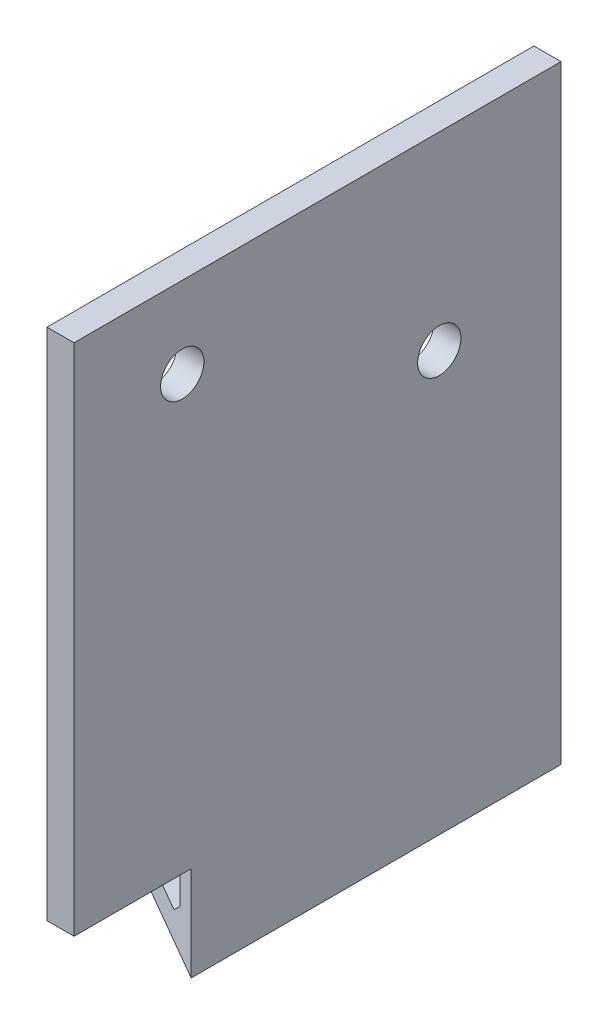
ISO-10303-21;
HEADER;
FILE_DESCRIPTION(('STEP AP214'),'2;1');
FILE_NAME('part.step','',(''),(''),'','','');
FILE_SCHEMA(('AUTOMOTIVE_DESIGN { 1 0 10303 214 1 1 1 1 }'));
ENDSEC;
DATA;
#1=APPLICATION_CONTEXT('core data for automotive mechanical design processes');
#2=APPLICATION_PROTOCOL_DEFINITION('international standard','automotive_design',2000,#1);
#3=PRODUCT_CONTEXT('',#1,'mechanical');
#4=PRODUCT('Part','Part','',(#3));
#5=PRODUCT_RELATED_PRODUCT_CATEGORY('part','',(#4));
#6=PRODUCT_DEFINITION_FORMATION('','',#4);
#7=PRODUCT_DEFINITION_CONTEXT('part definition',#1,'design');
#8=PRODUCT_DEFINITION('design','',#6,#7);
#9=PRODUCT_DEFINITION_SHAPE('','',#8);
#10=(LENGTH_UNIT() NAMED_UNIT(*) SI_UNIT(.MILLI.,.METRE.));
#11=(NAMED_UNIT(*) PLANE_ANGLE_UNIT() SI_UNIT($,.RADIAN.));
#12=(NAMED_UNIT(*) SI_UNIT($,.STERADIAN.) SOLID_ANGLE_UNIT());
#13=UNCERTAINTY_MEASURE_WITH_UNIT(LENGTH_MEASURE(1.E-05),#10,'distance_accuracy_value','');
#14=(GEOMETRIC_REPRESENTATION_CONTEXT(3) GLOBAL_UNCERTAINTY_ASSIGNED_CONTEXT((#13)) GLOBAL_UNIT_ASSIGNED_CONTEXT((#10,
#11,#12)) REPRESENTATION_CONTEXT('',''));
#15=CARTESIAN_POINT('',(0.,0.,0.));
#16=DIRECTION('',(0.,0.,1.));
#17=DIRECTION('',(1.,0.,0.));
#18=AXIS2_PLACEMENT_3D('',#15,#16,#17);
#19=CARTESIAN_POINT('',(0.,2.,36.));
#20=DIRECTION('',(1.,0.,0.));
#21=DIRECTION('',(0.,0.,-1.));
#22=AXIS2_PLACEMENT_3D('',#19,#20,#21);
#23=PLANE('',#22);
#24=DIRECTION('',(0.,0.,-1.));
#25=VECTOR('',#24,1.);
#26=CARTESIAN_POINT('',(0.,0.,36.));
#27=LINE('',#26,#25);
#28=CARTESIAN_POINT('',(0.,0.,18.6794919243115));
#29=VERTEX_POINT('',#28);
#30=CARTESIAN_POINT('',(0.,0.,0.));
#31=VERTEX_POINT('',#30);
#32=EDGE_CURVE('E242',#29,#31,#27,.T.);
#33=ORIENTED_EDGE('',*,*,#32,.F.);
#34=DIRECTION('',(0.,1.,0.));
#35=VECTOR('',#34,1.);
#36=CARTESIAN_POINT('',(0.,-0.00100000000000187,18.6794919243115));
#37=LINE('',#36,#35);
#38=CARTESIAN_POINT('',(0.,2.,18.6794919243115));
#39=VERTEX_POINT('',#38);
#40=EDGE_CURVE('E163',#29,#39,#37,.T.);
#41=ORIENTED_EDGE('',*,*,#40,.T.);
#42=DIRECTION('',(0.,0.,-1.));
#43=VECTOR('',#42,1.);
#44=CARTESIAN_POINT('',(0.,2.,36.));
#45=LINE('',#44,#43);
#46=CARTESIAN_POINT('',(0.,2.,0.));
#47=VERTEX_POINT('',#46);
#48=EDGE_CURVE('E210',#39,#47,#45,.T.);
#49=ORIENTED_EDGE('',*,*,#48,.T.);
#50=DIRECTION('',(0.,-1.,0.));
#51=VECTOR('',#50,1.);
#52=CARTESIAN_POINT('',(0.,2.,0.));
#53=LINE('',#52,#51);
#54=EDGE_CURVE('E193',#47,#31,#53,.T.);
#55=ORIENTED_EDGE('',*,*,#54,.T.);
#56=EDGE_LOOP('',(#33,#41,#49,#55));
#57=FACE_BOUND('',#56,.T.);
#58=ADVANCED_FACE('F45',(#57),#23,.F.);
#59=CARTESIAN_POINT('',(0.,0.,36.));
#60=DIRECTION('',(0.,1.,0.));
#61=DIRECTION('',(0.,0.,1.));
#62=AXIS2_PLACEMENT_3D('',#59,#60,#61);
#63=PLANE('',#62);
#64=CARTESIAN_POINT('',(7.5,0.,18.));
#65=DIRECTION('',(0.,-1.,0.));
#66=DIRECTION('',(0.,0.,-1.));
#67=AXIS2_PLACEMENT_3D('',#64,#65,#66);
#68=CIRCLE('',#67,1.5);
#69=CARTESIAN_POINT('',(7.5,0.,16.5));
#70=VERTEX_POINT('',#69);
#71=EDGE_CURVE('E184',#70,#70,#68,.T.);
#72=ORIENTED_EDGE('',*,*,#71,.F.);
#73=EDGE_LOOP('',(#72));
#74=FACE_BOUND('',#73,.T.);
#75=CARTESIAN_POINT('',(7.5,0.,8.));
#76=DIRECTION('',(0.,-1.,0.));
#77=DIRECTION('',(0.,0.,-1.));
#78=AXIS2_PLACEMENT_3D('',#75,#76,#77);
#79=CIRCLE('',#78,1.5);
#80=CARTESIAN_POINT('',(7.5,0.,6.5));
#81=VERTEX_POINT('',#80);
#82=EDGE_CURVE('E189',#81,#81,#79,.T.);
#83=ORIENTED_EDGE('',*,*,#82,.F.);
#84=EDGE_LOOP('',(#83));
#85=FACE_BOUND('',#84,.T.);
#86=DIRECTION('',(0.,0.,-1.));
#87=VECTOR('',#86,1.);
#88=CARTESIAN_POINT('',(15.,0.,36.));
#89=LINE('',#88,#87);
#90=CARTESIAN_POINT('',(15.,0.,27.3397459621557));
#91=VERTEX_POINT('',#90);
#92=CARTESIAN_POINT('',(15.,0.,0.));
#93=VERTEX_POINT('',#92);
#94=EDGE_CURVE('E239',#91,#93,#89,.T.);
#95=ORIENTED_EDGE('',*,*,#94,.F.);
#96=DIRECTION('',(0.866025403784442,0.,0.499999999999995));
#97=VECTOR('',#96,1.);
#98=CARTESIAN_POINT('',(30.,0.,36.));
#99=LINE('',#98,#97);
#100=EDGE_CURVE('E125',#29,#91,#99,.T.);
#101=ORIENTED_EDGE('',*,*,#100,.F.);
#102=ORIENTED_EDGE('',*,*,#32,.T.);
#103=DIRECTION('',(1.,0.,0.));
#104=VECTOR('',#103,1.);
#105=CARTESIAN_POINT('',(0.,0.,0.));
#106=LINE('',#105,#104);
#107=EDGE_CURVE('E214',#31,#93,#106,.T.);
#108=ORIENTED_EDGE('',*,*,#107,.T.);
#109=EDGE_LOOP('',(#95,#101,#102,#108));
#110=FACE_BOUND('',#109,.T.);
#111=ADVANCED_FACE('F258',(#74,#85,#110),#63,.F.);
#112=CARTESIAN_POINT('',(15.,0.,36.));
#113=DIRECTION('',(-1.,0.,0.));
#114=DIRECTION('',(0.,0.,1.));
#115=AXIS2_PLACEMENT_3D('',#112,#113,#114);
#116=PLANE('',#115);
#117=CARTESIAN_POINT('',(15.,39.,28.));
#118=DIRECTION('',(1.,0.,0.));
#119=DIRECTION('',(0.,0.,-1.));
#120=AXIS2_PLACEMENT_3D('',#117,#118,#119);
#121=CIRCLE('',#120,1.6);
#122=CARTESIAN_POINT('',(15.,39.,26.4));
#123=VERTEX_POINT('',#122);
#124=EDGE_CURVE('E168',#123,#123,#121,.T.);
#125=ORIENTED_EDGE('',*,*,#124,.F.);
#126=EDGE_LOOP('',(#125));
#127=FACE_BOUND('',#126,.T.);
#128=CARTESIAN_POINT('',(15.,31.,9.));
#129=DIRECTION('',(1.,0.,0.));
#130=DIRECTION('',(0.,0.,-1.));
#131=AXIS2_PLACEMENT_3D('',#128,#129,#130);
#132=CIRCLE('',#131,1.6);
#133=CARTESIAN_POINT('',(15.,31.,7.4));
#134=VERTEX_POINT('',#133);
#135=EDGE_CURVE('E173',#134,#134,#132,.T.);
#136=ORIENTED_EDGE('',*,*,#135,.F.);
#137=EDGE_LOOP('',(#136));
#138=FACE_BOUND('',#137,.T.);
#139=DIRECTION('',(0.,0.,1.));
#140=VECTOR('',#139,1.);
#141=CARTESIAN_POINT('',(15.,7.,27.3397459621557));
#142=LINE('',#141,#140);
#143=CARTESIAN_POINT('',(15.,7.,27.3397459621557));
#144=VERTEX_POINT('',#143);
#145=CARTESIAN_POINT('',(15.,7.,36.));
#146=VERTEX_POINT('',#145);
#147=EDGE_CURVE('E134',#144,#146,#142,.T.);
#148=ORIENTED_EDGE('',*,*,#147,.F.);
#149=DIRECTION('',(0.,1.,0.));
#150=VECTOR('',#149,1.);
#151=CARTESIAN_POINT('',(15.,-0.000999999999998331,27.3397459621557));
#152=LINE('',#151,#150);
#153=EDGE_CURVE('E119',#91,#144,#152,.T.);
#154=ORIENTED_EDGE('',*,*,#153,.F.);
#155=ORIENTED_EDGE('',*,*,#94,.T.);
#156=DIRECTION('',(0.,1.,0.));
#157=VECTOR('',#156,1.);
#158=CARTESIAN_POINT('',(15.,0.,0.));
#159=LINE('',#158,#157);
#160=CARTESIAN_POINT('',(15.,45.,0.));
#161=VERTEX_POINT('',#160);
#162=EDGE_CURVE('E218',#93,#161,#159,.T.);
#163=ORIENTED_EDGE('',*,*,#162,.T.);
#164=DIRECTION('',(0.,0.,-1.));
#165=VECTOR('',#164,1.);
#166=CARTESIAN_POINT('',(15.,45.,36.));
#167=LINE('',#166,#165);
#168=CARTESIAN_POINT('',(15.,45.,36.));
#169=VERTEX_POINT('',#168);
#170=EDGE_CURVE('E235',#169,#161,#167,.T.);
#171=ORIENTED_EDGE('',*,*,#170,.F.);
#172=DIRECTION('',(0.,1.,0.));
#173=VECTOR('',#172,1.);
#174=CARTESIAN_POINT('',(15.,0.,36.));
#175=LINE('',#174,#173);
#176=EDGE_CURVE('E142',#146,#169,#175,.T.);
#177=ORIENTED_EDGE('',*,*,#176,.F.);
#178=EDGE_LOOP('',(#148,#154,#155,#163,#171,#177));
#179=FACE_BOUND('',#178,.T.);
#180=ADVANCED_FACE('F140',(#127,#138,#179),#116,.F.);
#181=CARTESIAN_POINT('',(15.,45.,36.));
#182=DIRECTION('',(0.,-1.,0.));
#183=DIRECTION('',(0.,0.,-1.));
#184=AXIS2_PLACEMENT_3D('',#181,#182,#183);
#185=PLANE('',#184);
#186=DIRECTION('',(-1.,0.,0.));
#187=VECTOR('',#186,1.);
#188=CARTESIAN_POINT('',(15.,45.,0.));
#189=LINE('',#188,#187);
#190=CARTESIAN_POINT('',(13.,45.,0.));
#191=VERTEX_POINT('',#190);
#192=EDGE_CURVE('E221',#161,#191,#189,.T.);
#193=ORIENTED_EDGE('',*,*,#192,.T.);
#194=DIRECTION('',(0.,0.,-1.));
#195=VECTOR('',#194,1.);
#196=CARTESIAN_POINT('',(13.,45.,36.));
#197=LINE('',#196,#195);
#198=CARTESIAN_POINT('',(13.,45.,36.));
#199=VERTEX_POINT('',#198);
#200=EDGE_CURVE('E231',#199,#191,#197,.T.);
#201=ORIENTED_EDGE('',*,*,#200,.F.);
#202=DIRECTION('',(-1.,0.,0.));
#203=VECTOR('',#202,1.);
#204=CARTESIAN_POINT('',(15.,45.,36.));
#205=LINE('',#204,#203);
#206=EDGE_CURVE('E202',#169,#199,#205,.T.);
#207=ORIENTED_EDGE('',*,*,#206,.F.);
#208=ORIENTED_EDGE('',*,*,#170,.T.);
#209=EDGE_LOOP('',(#193,#201,#207,#208));
#210=FACE_BOUND('',#209,.T.);
#211=ADVANCED_FACE('F264',(#210),#185,.F.);
#212=CARTESIAN_POINT('',(13.,45.,36.));
#213=DIRECTION('',(1.,0.,0.));
#214=DIRECTION('',(0.,1.,0.));
#215=AXIS2_PLACEMENT_3D('',#212,#213,#214);
#216=PLANE('',#215);
#217=CARTESIAN_POINT('',(13.,39.,28.));
#218=DIRECTION('',(1.,0.,0.));
#219=DIRECTION('',(0.,1.,0.));
#220=AXIS2_PLACEMENT_3D('',#217,#218,#219);
#221=CIRCLE('',#220,1.6);
#222=CARTESIAN_POINT('',(13.,39.,26.4));
#223=VERTEX_POINT('',#222);
#224=EDGE_CURVE('E172',#223,#223,#221,.F.);
#225=ORIENTED_EDGE('',*,*,#224,.F.);
#226=EDGE_LOOP('',(#225));
#227=FACE_BOUND('',#226,.T.);
#228=CARTESIAN_POINT('',(13.,31.,9.));
#229=DIRECTION('',(1.,0.,0.));
#230=DIRECTION('',(0.,1.,0.));
#231=AXIS2_PLACEMENT_3D('',#228,#229,#230);
#232=CIRCLE('',#231,1.6);
#233=CARTESIAN_POINT('',(13.,31.,7.4));
#234=VERTEX_POINT('',#233);
#235=EDGE_CURVE('E167',#234,#234,#232,.F.);
#236=ORIENTED_EDGE('',*,*,#235,.F.);
#237=EDGE_LOOP('',(#236));
#238=FACE_BOUND('',#237,.T.);
#239=DIRECTION('',(0.,0.,1.));
#240=VECTOR('',#239,1.);
#241=CARTESIAN_POINT('',(13.,3.,36.));
#242=LINE('',#241,#240);
#243=CARTESIAN_POINT('',(13.,3.,0.));
#244=VERTEX_POINT('',#243);
#245=CARTESIAN_POINT('',(13.,3.,26.1850454237765));
#246=VERTEX_POINT('',#245);
#247=EDGE_CURVE('E55',#244,#246,#242,.T.);
#248=ORIENTED_EDGE('',*,*,#247,.T.);
#249=DIRECTION('',(0.,1.,0.));
#250=VECTOR('',#249,1.);
#251=CARTESIAN_POINT('',(13.,45.,26.1850454237765));
#252=LINE('',#251,#250);
#253=CARTESIAN_POINT('',(13.,7.,26.1850454237765));
#254=VERTEX_POINT('',#253);
#255=EDGE_CURVE('E153',#246,#254,#252,.T.);
#256=ORIENTED_EDGE('',*,*,#255,.T.);
#257=DIRECTION('',(0.,0.,1.));
#258=VECTOR('',#257,1.);
#259=CARTESIAN_POINT('',(13.,7.,36.));
#260=LINE('',#259,#258);
#261=CARTESIAN_POINT('',(13.,7.,36.));
#262=VERTEX_POINT('',#261);
#263=EDGE_CURVE('E130',#254,#262,#260,.T.);
#264=ORIENTED_EDGE('',*,*,#263,.T.);
#265=DIRECTION('',(0.,-1.,0.));
#266=VECTOR('',#265,1.);
#267=CARTESIAN_POINT('',(13.,45.,36.));
#268=LINE('',#267,#266);
#269=EDGE_CURVE('E206',#199,#262,#268,.T.);
#270=ORIENTED_EDGE('',*,*,#269,.F.);
#271=ORIENTED_EDGE('',*,*,#200,.T.);
#272=DIRECTION('',(0.,-1.,0.));
#273=VECTOR('',#272,1.);
#274=CARTESIAN_POINT('',(13.,45.,0.));
#275=LINE('',#274,#273);
#276=EDGE_CURVE('E224',#191,#244,#275,.T.);
#277=ORIENTED_EDGE('',*,*,#276,.T.);
#278=EDGE_LOOP('',(#248,#256,#264,#270,#271,#277));
#279=FACE_BOUND('',#278,.T.);
#280=ADVANCED_FACE('F250',(#227,#238,#279),#216,.F.);
#281=CARTESIAN_POINT('',(13.,2.,36.));
#282=DIRECTION('',(0.,-1.,0.));
#283=DIRECTION('',(1.,0.,0.));
#284=AXIS2_PLACEMENT_3D('',#281,#282,#283);
#285=PLANE('',#284);
#286=CARTESIAN_POINT('',(7.5,2.,18.));
#287=DIRECTION('',(0.,-1.,0.));
#288=DIRECTION('',(1.,0.,0.));
#289=AXIS2_PLACEMENT_3D('',#286,#287,#288);
#290=CIRCLE('',#289,1.5);
#291=CARTESIAN_POINT('',(9.00000000000001,2.,18.));
#292=VERTEX_POINT('',#291);
#293=EDGE_CURVE('E188',#292,#292,#290,.F.);
#294=ORIENTED_EDGE('',*,*,#293,.F.);
#295=EDGE_LOOP('',(#294));
#296=FACE_BOUND('',#295,.T.);
#297=CARTESIAN_POINT('',(7.5,2.,8.));
#298=DIRECTION('',(0.,-1.,0.));
#299=DIRECTION('',(1.,0.,0.));
#300=AXIS2_PLACEMENT_3D('',#297,#298,#299);
#301=CIRCLE('',#300,1.5);
#302=CARTESIAN_POINT('',(9.00000000000001,2.,8.));
#303=VERTEX_POINT('',#302);
#304=EDGE_CURVE('E177',#303,#303,#301,.F.);
#305=ORIENTED_EDGE('',*,*,#304,.F.);
#306=EDGE_LOOP('',(#305));
#307=FACE_BOUND('',#306,.T.);
#308=ORIENTED_EDGE('',*,*,#48,.F.);
#309=DIRECTION('',(-0.866025403784442,0.,-0.499999999999995));
#310=VECTOR('',#309,1.);
#311=CARTESIAN_POINT('',(30.,2.,36.));
#312=LINE('',#311,#310);
#313=CARTESIAN_POINT('',(12.,2.,25.6076951545869));
#314=VERTEX_POINT('',#313);
#315=EDGE_CURVE('E160',#314,#39,#312,.T.);
#316=ORIENTED_EDGE('',*,*,#315,.F.);
#317=DIRECTION('',(0.,0.,-1.));
#318=VECTOR('',#317,1.);
#319=CARTESIAN_POINT('',(12.,2.,0.));
#320=LINE('',#319,#318);
#321=CARTESIAN_POINT('',(12.,2.,0.));
#322=VERTEX_POINT('',#321);
#323=EDGE_CURVE('E68',#314,#322,#320,.T.);
#324=ORIENTED_EDGE('',*,*,#323,.T.);
#325=DIRECTION('',(-1.,0.,0.));
#326=VECTOR('',#325,1.);
#327=CARTESIAN_POINT('',(13.,2.,0.));
#328=LINE('',#327,#326);
#329=EDGE_CURVE('E203',#322,#47,#328,.T.);
#330=ORIENTED_EDGE('',*,*,#329,.T.);
#331=EDGE_LOOP('',(#308,#316,#324,#330));
#332=FACE_BOUND('',#331,.T.);
#333=ADVANCED_FACE('F253',(#296,#307,#332),#285,.F.);
#334=CARTESIAN_POINT('',(0.,0.,36.));
#335=DIRECTION('',(0.,0.,1.));
#336=DIRECTION('',(1.,0.,0.));
#337=AXIS2_PLACEMENT_3D('',#334,#335,#336);
#338=PLANE('',#337);
#339=DIRECTION('',(-1.,0.,0.));
#340=VECTOR('',#339,1.);
#341=CARTESIAN_POINT('',(15.,7.,36.));
#342=LINE('',#341,#340);
#343=EDGE_CURVE('E144',#146,#262,#342,.T.);
#344=ORIENTED_EDGE('',*,*,#343,.F.);
#345=ORIENTED_EDGE('',*,*,#176,.T.);
#346=ORIENTED_EDGE('',*,*,#206,.T.);
#347=ORIENTED_EDGE('',*,*,#269,.T.);
#348=EDGE_LOOP('',(#344,#345,#346,#347));
#349=FACE_BOUND('',#348,.T.);
#350=ADVANCED_FACE('F269',(#349),#338,.T.);
#351=CARTESIAN_POINT('',(0.,0.,0.));
#352=DIRECTION('',(0.,0.,1.));
#353=DIRECTION('',(1.,0.,0.));
#354=AXIS2_PLACEMENT_3D('',#351,#352,#353);
#355=PLANE('',#354);
#356=ORIENTED_EDGE('',*,*,#54,.F.);
#357=ORIENTED_EDGE('',*,*,#329,.F.);
#358=DIRECTION('',(-0.70710678118655,-0.707106781186545,0.));
#359=VECTOR('',#358,1.);
#360=CARTESIAN_POINT('',(4.99999999999996,-4.99999999999999,0.));
#361=LINE('',#360,#359);
#362=EDGE_CURVE('E11',#322,#244,#361,.F.);
#363=ORIENTED_EDGE('',*,*,#362,.T.);
#364=ORIENTED_EDGE('',*,*,#276,.F.);
#365=ORIENTED_EDGE('',*,*,#192,.F.);
#366=ORIENTED_EDGE('',*,*,#162,.F.);
#367=ORIENTED_EDGE('',*,*,#107,.F.);
#368=EDGE_LOOP('',(#356,#357,#363,#364,#365,#366,#367));
#369=FACE_BOUND('',#368,.T.);
#370=ADVANCED_FACE('F266',(#369),#355,.F.);
#371=CARTESIAN_POINT('',(7.5,45.001,8.));
#372=DIRECTION('',(0.,-1.,0.));
#373=DIRECTION('',(0.,0.,-1.));
#374=AXIS2_PLACEMENT_3D('',#371,#372,#373);
#375=CYLINDRICAL_SURFACE('',#374,1.5);
#376=ORIENTED_EDGE('',*,*,#82,.T.);
#377=EDGE_LOOP('',(#376));
#378=FACE_BOUND('',#377,.T.);
#379=ORIENTED_EDGE('',*,*,#304,.T.);
#380=EDGE_LOOP('',(#379));
#381=FACE_BOUND('',#380,.T.);
#382=ADVANCED_FACE('F268',(#378,#381),#375,.F.);
#383=CARTESIAN_POINT('',(7.5,45.001,18.));
#384=DIRECTION('',(0.,-1.,0.));
#385=DIRECTION('',(0.,0.,-1.));
#386=AXIS2_PLACEMENT_3D('',#383,#384,#385);
#387=CYLINDRICAL_SURFACE('',#386,1.5);
#388=ORIENTED_EDGE('',*,*,#71,.T.);
#389=EDGE_LOOP('',(#388));
#390=FACE_BOUND('',#389,.T.);
#391=ORIENTED_EDGE('',*,*,#293,.T.);
#392=EDGE_LOOP('',(#391));
#393=FACE_BOUND('',#392,.T.);
#394=ADVANCED_FACE('F275',(#390,#393),#387,.F.);
#395=CARTESIAN_POINT('',(12.,2.,36.));
#396=DIRECTION('',(-0.707106781186545,0.70710678118655,0.));
#397=DIRECTION('',(0.,0.,1.));
#398=AXIS2_PLACEMENT_3D('',#395,#396,#397);
#399=PLANE('',#398);
#400=ORIENTED_EDGE('',*,*,#323,.F.);
#401=DIRECTION('',(-0.65465367070798,-0.654653670707976,-0.377964473009224));
#402=VECTOR('',#401,1.);
#403=CARTESIAN_POINT('',(14.5714285714285,4.57142857142851,27.092310132503));
#404=LINE('',#403,#402);
#405=EDGE_CURVE('E147',#314,#246,#404,.F.);
#406=ORIENTED_EDGE('',*,*,#405,.T.);
#407=ORIENTED_EDGE('',*,*,#247,.F.);
#408=ORIENTED_EDGE('',*,*,#362,.F.);
#409=EDGE_LOOP('',(#400,#406,#407,#408));
#410=FACE_BOUND('',#409,.T.);
#411=ADVANCED_FACE('F48',(#410),#399,.T.);
#412=CARTESIAN_POINT('',(-0.000999999999999265,31.,9.));
#413=DIRECTION('',(1.,0.,0.));
#414=DIRECTION('',(0.,0.,-1.));
#415=AXIS2_PLACEMENT_3D('',#412,#413,#414);
#416=CYLINDRICAL_SURFACE('',#415,1.6);
#417=CARTESIAN_POINT('',(15.,31.,7.4));
#418=CARTESIAN_POINT('',(14.9791666666667,31.,7.4));
#419=CARTESIAN_POINT('',(14.9583333333333,31.,7.4));
#420=CARTESIAN_POINT('',(14.9166666666667,31.,7.4));
#421=CARTESIAN_POINT('',(14.8958333333333,31.,7.4));
#422=CARTESIAN_POINT('',(14.8541666666667,31.,7.4));
#423=CARTESIAN_POINT('',(14.8333333333333,31.,7.4));
#424=CARTESIAN_POINT('',(14.7916666666667,31.,7.4));
#425=CARTESIAN_POINT('',(14.7708333333333,31.,7.4));
#426=CARTESIAN_POINT('',(14.7291666666667,31.,7.4));
#427=CARTESIAN_POINT('',(14.7083333333333,31.,7.4));
#428=CARTESIAN_POINT('',(14.6666666666667,31.,7.4));
#429=CARTESIAN_POINT('',(14.6458333333333,31.,7.4));
#430=CARTESIAN_POINT('',(14.6041666666667,31.,7.4));
#431=CARTESIAN_POINT('',(14.5833333333333,31.,7.4));
#432=CARTESIAN_POINT('',(14.5416666666667,31.,7.4));
#433=CARTESIAN_POINT('',(14.5208333333333,31.,7.4));
#434=CARTESIAN_POINT('',(14.4791666666667,31.,7.4));
#435=CARTESIAN_POINT('',(14.4583333333333,31.,7.4));
#436=CARTESIAN_POINT('',(14.4166666666667,31.,7.4));
#437=CARTESIAN_POINT('',(14.3958333333333,31.,7.4));
#438=CARTESIAN_POINT('',(14.3541666666667,31.,7.4));
#439=CARTESIAN_POINT('',(14.3333333333333,31.,7.4));
#440=CARTESIAN_POINT('',(14.2916666666667,31.,7.4));
#441=CARTESIAN_POINT('',(14.2708333333333,31.,7.4));
#442=CARTESIAN_POINT('',(14.2291666666667,31.,7.4));
#443=CARTESIAN_POINT('',(14.2083333333333,31.,7.4));
#444=CARTESIAN_POINT('',(14.1666666666667,31.,7.4));
#445=CARTESIAN_POINT('',(14.1458333333333,31.,7.4));
#446=CARTESIAN_POINT('',(14.1041666666667,31.,7.4));
#447=CARTESIAN_POINT('',(14.0833333333333,31.,7.4));
#448=CARTESIAN_POINT('',(14.0416666666667,31.,7.4));
#449=CARTESIAN_POINT('',(14.0208333333333,31.,7.4));
#450=CARTESIAN_POINT('',(13.9791666666667,31.,7.4));
#451=CARTESIAN_POINT('',(13.9583333333333,31.,7.4));
#452=CARTESIAN_POINT('',(13.9166666666667,31.,7.4));
#453=CARTESIAN_POINT('',(13.8958333333333,31.,7.4));
#454=CARTESIAN_POINT('',(13.8541666666667,31.,7.4));
#455=CARTESIAN_POINT('',(13.8333333333333,31.,7.4));
#456=CARTESIAN_POINT('',(13.7916666666667,31.,7.4));
#457=CARTESIAN_POINT('',(13.7708333333333,31.,7.4));
#458=CARTESIAN_POINT('',(13.7291666666667,31.,7.4));
#459=CARTESIAN_POINT('',(13.7083333333333,31.,7.4));
#460=CARTESIAN_POINT('',(13.6666666666667,31.,7.4));
#461=CARTESIAN_POINT('',(13.6458333333333,31.,7.4));
#462=CARTESIAN_POINT('',(13.6041666666667,31.,7.4));
#463=CARTESIAN_POINT('',(13.5833333333333,31.,7.4));
#464=CARTESIAN_POINT('',(13.5416666666667,31.,7.4));
#465=CARTESIAN_POINT('',(13.5208333333333,31.,7.4));
#466=CARTESIAN_POINT('',(13.4791666666667,31.,7.4));
#467=CARTESIAN_POINT('',(13.4583333333333,31.,7.4));
#468=CARTESIAN_POINT('',(13.4166666666667,31.,7.4));
#469=CARTESIAN_POINT('',(13.3958333333333,31.,7.4));
#470=CARTESIAN_POINT('',(13.3541666666667,31.,7.4));
#471=CARTESIAN_POINT('',(13.3333333333333,31.,7.4));
#472=CARTESIAN_POINT('',(13.2916666666667,31.,7.4));
#473=CARTESIAN_POINT('',(13.2708333333333,31.,7.4));
#474=CARTESIAN_POINT('',(13.2291666666667,31.,7.4));
#475=CARTESIAN_POINT('',(13.2083333333333,31.,7.4));
#476=CARTESIAN_POINT('',(13.1666666666667,31.,7.4));
#477=CARTESIAN_POINT('',(13.1458333333333,31.,7.4));
#478=CARTESIAN_POINT('',(13.1041666666667,31.,7.4));
#479=CARTESIAN_POINT('',(13.0833333333333,31.,7.4));
#480=CARTESIAN_POINT('',(13.0416666666667,31.,7.4));
#481=CARTESIAN_POINT('',(13.0208333333333,31.,7.4));
#482=CARTESIAN_POINT('',(13.,31.,7.4));
#483=B_SPLINE_CURVE_WITH_KNOTS('',3,(#417,#418,#419,#420,#421,#422,#423,#424,#425,#426,#427,
#428,#429,#430,#431,#432,#433,#434,#435,#436,#437,#438,#439,#440,#441,#442,#443,#444,#445,#446,
#447,#448,#449,#450,#451,#452,#453,#454,#455,#456,#457,#458,#459,#460,#461,#462,#463,#464,#465,
#466,#467,#468,#469,#470,#471,#472,#473,#474,#475,#476,#477,#478,#479,#480,#481,#482),
.UNSPECIFIED.,.F.,.F.,(4,2,2,2,2,2,2,2,2,2,2,2,2,2,2,2,2,2,2,2,2,2,2,2,2,2,2,2,2,2,2,2,4),(0.,
0.0625000000000001,0.125,0.1875,0.25,0.3125,0.375,0.4375,0.5,0.5625,0.625000000000001,
0.687500000000001,0.750000000000001,0.812500000000001,0.875000000000001,0.937500000000001,1.,
1.0625,1.125,1.1875,1.25,1.3125,1.375,1.4375,1.5,1.5625,1.625,1.6875,1.75,1.8125,1.875,1.9375,
2.),.UNSPECIFIED.);
#484=EDGE_CURVE('BSEAM310',#134,#234,#483,.T.);
#485=ORIENTED_EDGE('',*,*,#135,.T.);
#486=ORIENTED_EDGE('',*,*,#235,.T.);
#487=ORIENTED_EDGE('',*,*,#484,.T.);
#488=ORIENTED_EDGE('',*,*,#484,.F.);
#489=EDGE_LOOP('',(#485,#487,#486,#488));
#490=FACE_BOUND('',#489,.T.);
#491=ADVANCED_FACE('F310',(#490),#416,.F.);
#492=CARTESIAN_POINT('',(-0.000999999999999265,39.,28.));
#493=DIRECTION('',(1.,0.,0.));
#494=DIRECTION('',(0.,0.,-1.));
#495=AXIS2_PLACEMENT_3D('',#492,#493,#494);
#496=CYLINDRICAL_SURFACE('',#495,1.6);
#497=CARTESIAN_POINT('',(15.,39.,26.4));
#498=CARTESIAN_POINT('',(14.9791666666667,39.,26.4));
#499=CARTESIAN_POINT('',(14.9583333333333,39.,26.4));
#500=CARTESIAN_POINT('',(14.9166666666667,39.,26.4));
#501=CARTESIAN_POINT('',(14.8958333333333,39.,26.4));
#502=CARTESIAN_POINT('',(14.8541666666667,39.,26.4));
#503=CARTESIAN_POINT('',(14.8333333333333,39.,26.4));
#504=CARTESIAN_POINT('',(14.7916666666667,39.,26.4));
#505=CARTESIAN_POINT('',(14.7708333333333,39.,26.4));
#506=CARTESIAN_POINT('',(14.7291666666667,39.,26.4));
#507=CARTESIAN_POINT('',(14.7083333333333,39.,26.4));
#508=CARTESIAN_POINT('',(14.6666666666667,39.,26.4));
#509=CARTESIAN_POINT('',(14.6458333333333,39.,26.4));
#510=CARTESIAN_POINT('',(14.6041666666667,39.,26.4));
#511=CARTESIAN_POINT('',(14.5833333333333,39.,26.4));
#512=CARTESIAN_POINT('',(14.5416666666667,39.,26.4));
#513=CARTESIAN_POINT('',(14.5208333333333,39.,26.4));
#514=CARTESIAN_POINT('',(14.4791666666667,39.,26.4));
#515=CARTESIAN_POINT('',(14.4583333333333,39.,26.4));
#516=CARTESIAN_POINT('',(14.4166666666667,39.,26.4));
#517=CARTESIAN_POINT('',(14.3958333333333,39.,26.4));
#518=CARTESIAN_POINT('',(14.3541666666667,39.,26.4));
#519=CARTESIAN_POINT('',(14.3333333333333,39.,26.4));
#520=CARTESIAN_POINT('',(14.2916666666667,39.,26.4));
#521=CARTESIAN_POINT('',(14.2708333333333,39.,26.4));
#522=CARTESIAN_POINT('',(14.2291666666667,39.,26.4));
#523=CARTESIAN_POINT('',(14.2083333333333,39.,26.4));
#524=CARTESIAN_POINT('',(14.1666666666667,39.,26.4));
#525=CARTESIAN_POINT('',(14.1458333333333,39.,26.4));
#526=CARTESIAN_POINT('',(14.1041666666667,39.,26.4));
#527=CARTESIAN_POINT('',(14.0833333333333,39.,26.4));
#528=CARTESIAN_POINT('',(14.0416666666667,39.,26.4));
#529=CARTESIAN_POINT('',(14.0208333333333,39.,26.4));
#530=CARTESIAN_POINT('',(13.9791666666667,39.,26.4));
#531=CARTESIAN_POINT('',(13.9583333333333,39.,26.4));
#532=CARTESIAN_POINT('',(13.9166666666667,39.,26.4));
#533=CARTESIAN_POINT('',(13.8958333333333,39.,26.4));
#534=CARTESIAN_POINT('',(13.8541666666667,39.,26.4));
#535=CARTESIAN_POINT('',(13.8333333333333,39.,26.4));
#536=CARTESIAN_POINT('',(13.7916666666667,39.,26.4));
#537=CARTESIAN_POINT('',(13.7708333333333,39.,26.4));
#538=CARTESIAN_POINT('',(13.7291666666667,39.,26.4));
#539=CARTESIAN_POINT('',(13.7083333333333,39.,26.4));
#540=CARTESIAN_POINT('',(13.6666666666667,39.,26.4));
#541=CARTESIAN_POINT('',(13.6458333333333,39.,26.4));
#542=CARTESIAN_POINT('',(13.6041666666667,39.,26.4));
#543=CARTESIAN_POINT('',(13.5833333333333,39.,26.4));
#544=CARTESIAN_POINT('',(13.5416666666667,39.,26.4));
#545=CARTESIAN_POINT('',(13.5208333333333,39.,26.4));
#546=CARTESIAN_POINT('',(13.4791666666667,39.,26.4));
#547=CARTESIAN_POINT('',(13.4583333333333,39.,26.4));
#548=CARTESIAN_POINT('',(13.4166666666667,39.,26.4));
#549=CARTESIAN_POINT('',(13.3958333333333,39.,26.4));
#550=CARTESIAN_POINT('',(13.3541666666667,39.,26.4));
#551=CARTESIAN_POINT('',(13.3333333333333,39.,26.4));
#552=CARTESIAN_POINT('',(13.2916666666667,39.,26.4));
#553=CARTESIAN_POINT('',(13.2708333333333,39.,26.4));
#554=CARTESIAN_POINT('',(13.2291666666667,39.,26.4));
#555=CARTESIAN_POINT('',(13.2083333333333,39.,26.4));
#556=CARTESIAN_POINT('',(13.1666666666667,39.,26.4));
#557=CARTESIAN_POINT('',(13.1458333333333,39.,26.4));
#558=CARTESIAN_POINT('',(13.1041666666667,39.,26.4));
#559=CARTESIAN_POINT('',(13.0833333333333,39.,26.4));
#560=CARTESIAN_POINT('',(13.0416666666667,39.,26.4));
#561=CARTESIAN_POINT('',(13.0208333333333,39.,26.4));
#562=CARTESIAN_POINT('',(13.,39.,26.4));
#563=B_SPLINE_CURVE_WITH_KNOTS('',3,(#497,#498,#499,#500,#501,#502,#503,#504,#505,#506,#507,
#508,#509,#510,#511,#512,#513,#514,#515,#516,#517,#518,#519,#520,#521,#522,#523,#524,#525,#526,
#527,#528,#529,#530,#531,#532,#533,#534,#535,#536,#537,#538,#539,#540,#541,#542,#543,#544,#545,
#546,#547,#548,#549,#550,#551,#552,#553,#554,#555,#556,#557,#558,#559,#560,#561,#562),
.UNSPECIFIED.,.F.,.F.,(4,2,2,2,2,2,2,2,2,2,2,2,2,2,2,2,2,2,2,2,2,2,2,2,2,2,2,2,2,2,2,2,4),(0.,
0.0625000000000001,0.125,0.1875,0.25,0.3125,0.375,0.4375,0.5,0.5625,0.625000000000001,
0.687500000000001,0.750000000000001,0.812500000000001,0.875000000000001,0.937500000000001,1.,
1.0625,1.125,1.1875,1.25,1.3125,1.375,1.4375,1.5,1.5625,1.625,1.6875,1.75,1.8125,1.875,1.9375,
2.),.UNSPECIFIED.);
#564=EDGE_CURVE('BSEAM314',#123,#223,#563,.T.);
#565=ORIENTED_EDGE('',*,*,#124,.T.);
#566=ORIENTED_EDGE('',*,*,#224,.T.);
#567=ORIENTED_EDGE('',*,*,#564,.T.);
#568=ORIENTED_EDGE('',*,*,#564,.F.);
#569=EDGE_LOOP('',(#565,#567,#566,#568));
#570=FACE_BOUND('',#569,.T.);
#571=ADVANCED_FACE('F314',(#570),#496,.F.);
#572=CARTESIAN_POINT('',(30.,-0.000999999999998832,36.));
#573=DIRECTION('',(0.499999999999995,0.,-0.866025403784442));
#574=DIRECTION('',(-0.866025403784442,0.,-0.499999999999995));
#575=AXIS2_PLACEMENT_3D('',#572,#573,#574);
#576=PLANE('',#575);
#577=ORIENTED_EDGE('',*,*,#100,.T.);
#578=ORIENTED_EDGE('',*,*,#153,.T.);
#579=DIRECTION('',(0.866025403784442,0.,0.499999999999994));
#580=VECTOR('',#579,1.);
#581=CARTESIAN_POINT('',(12.,7.,25.6076951545869));
#582=LINE('',#581,#580);
#583=EDGE_CURVE('E122',#254,#144,#582,.T.);
#584=ORIENTED_EDGE('',*,*,#583,.F.);
#585=ORIENTED_EDGE('',*,*,#255,.F.);
#586=ORIENTED_EDGE('',*,*,#405,.F.);
#587=ORIENTED_EDGE('',*,*,#315,.T.);
#588=ORIENTED_EDGE('',*,*,#40,.F.);
#589=EDGE_LOOP('',(#577,#578,#584,#585,#586,#587,#588));
#590=FACE_BOUND('',#589,.T.);
#591=ADVANCED_FACE('F121',(#590),#576,.F.);
#592=CARTESIAN_POINT('',(0.,7.,0.));
#593=DIRECTION('',(0.,1.,0.));
#594=DIRECTION('',(-1.,0.,0.));
#595=AXIS2_PLACEMENT_3D('',#592,#593,#594);
#596=PLANE('',#595);
#597=ORIENTED_EDGE('',*,*,#583,.T.);
#598=ORIENTED_EDGE('',*,*,#147,.T.);
#599=ORIENTED_EDGE('',*,*,#343,.T.);
#600=ORIENTED_EDGE('',*,*,#263,.F.);
#601=EDGE_LOOP('',(#597,#598,#599,#600));
#602=FACE_BOUND('',#601,.T.);
#603=ADVANCED_FACE('F133',(#602),#596,.F.);
#604=CLOSED_SHELL('',(#58,#111,#180,#211,#280,#333,#350,#370,#382,#394,#411,#491,#571,#591,#603));
#605=MANIFOLD_SOLID_BREP('B2',#604);
#606=ADVANCED_BREP_SHAPE_REPRESENTATION('',(#18,#605),#14);
#607=SHAPE_DEFINITION_REPRESENTATION(#9,#606);
ENDSEC;
END-ISO-10303-21;
